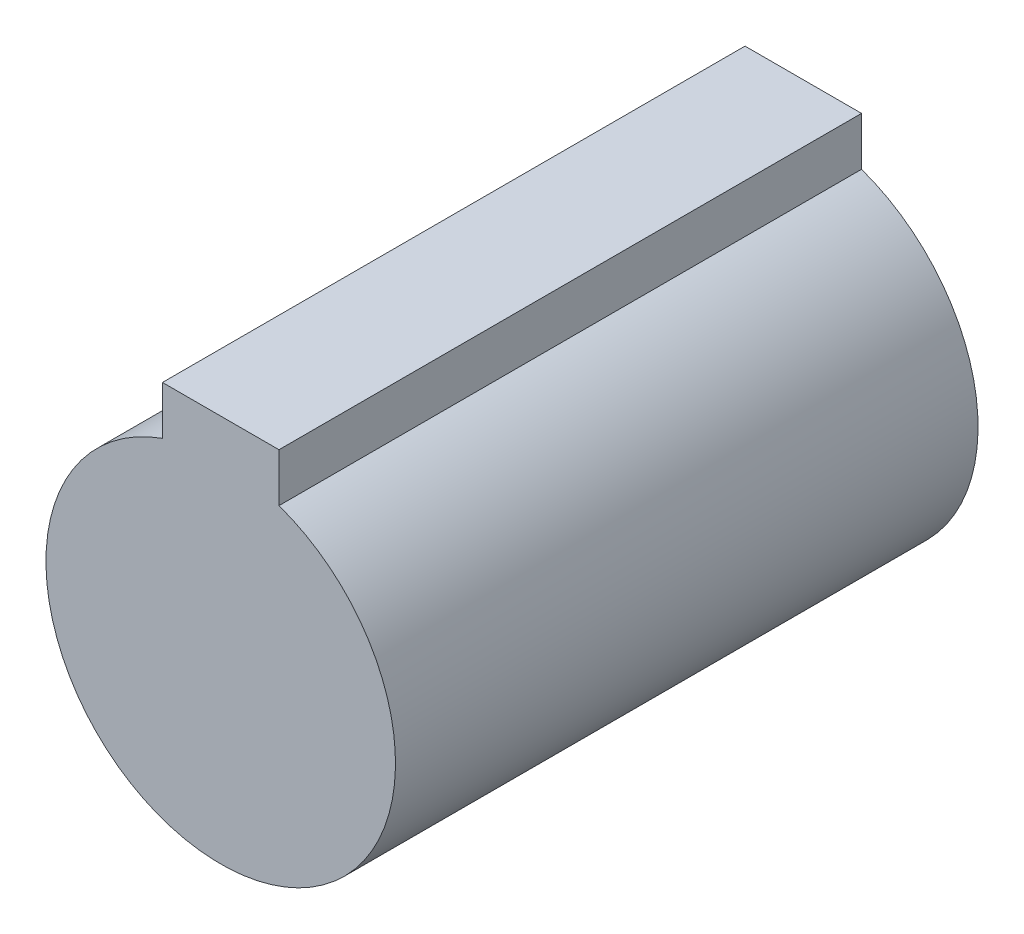
ISO-10303-21;
HEADER;
FILE_DESCRIPTION(('STEP AP214'),'2;1');
FILE_NAME('part.step','',(''),(''),'','','');
FILE_SCHEMA(('AUTOMOTIVE_DESIGN { 1 0 10303 214 1 1 1 1 }'));
ENDSEC;
DATA;
#1=APPLICATION_CONTEXT('core data for automotive mechanical design processes');
#2=APPLICATION_PROTOCOL_DEFINITION('international standard','automotive_design',2000,#1);
#3=PRODUCT_CONTEXT('',#1,'mechanical');
#4=PRODUCT('Part','Part','',(#3));
#5=PRODUCT_RELATED_PRODUCT_CATEGORY('part','',(#4));
#6=PRODUCT_DEFINITION_FORMATION('','',#4);
#7=PRODUCT_DEFINITION_CONTEXT('part definition',#1,'design');
#8=PRODUCT_DEFINITION('design','',#6,#7);
#9=PRODUCT_DEFINITION_SHAPE('','',#8);
#10=(LENGTH_UNIT() NAMED_UNIT(*) SI_UNIT(.MILLI.,.METRE.));
#11=(NAMED_UNIT(*) PLANE_ANGLE_UNIT() SI_UNIT($,.RADIAN.));
#12=(NAMED_UNIT(*) SI_UNIT($,.STERADIAN.) SOLID_ANGLE_UNIT());
#13=UNCERTAINTY_MEASURE_WITH_UNIT(LENGTH_MEASURE(1.E-05),#10,'distance_accuracy_value','');
#14=(GEOMETRIC_REPRESENTATION_CONTEXT(3) GLOBAL_UNCERTAINTY_ASSIGNED_CONTEXT((#13)) GLOBAL_UNIT_ASSIGNED_CONTEXT((#10,
#11,#12)) REPRESENTATION_CONTEXT('',''));
#15=CARTESIAN_POINT('',(0.,0.,0.));
#16=DIRECTION('',(0.,0.,1.));
#17=DIRECTION('',(1.,0.,0.));
#18=AXIS2_PLACEMENT_3D('',#15,#16,#17);
#19=CARTESIAN_POINT('',(0.,0.,50.));
#20=DIRECTION('',(0.,0.,-1.));
#21=DIRECTION('',(-1.,0.,0.));
#22=AXIS2_PLACEMENT_3D('',#19,#20,#21);
#23=CYLINDRICAL_SURFACE('',#22,15.);
#24=CARTESIAN_POINT('',(0.,0.,0.));
#25=DIRECTION('',(0.,0.,1.));
#26=DIRECTION('',(1.,0.,0.));
#27=AXIS2_PLACEMENT_3D('',#24,#25,#26);
#28=CIRCLE('',#27,15.);
#29=CARTESIAN_POINT('',(-5.,14.1421356237309,0.));
#30=VERTEX_POINT('',#29);
#31=CARTESIAN_POINT('',(5.,14.1421356237309,0.));
#32=VERTEX_POINT('',#31);
#33=EDGE_CURVE('E100',#30,#32,#28,.T.);
#34=ORIENTED_EDGE('',*,*,#33,.T.);
#35=DIRECTION('',(0.,0.,-1.));
#36=VECTOR('',#35,1.);
#37=CARTESIAN_POINT('',(5.,14.1421356237309,50.));
#38=LINE('',#37,#36);
#39=CARTESIAN_POINT('',(5.,14.1421356237309,50.));
#40=VERTEX_POINT('',#39);
#41=EDGE_CURVE('E11',#40,#32,#38,.T.);
#42=ORIENTED_EDGE('',*,*,#41,.F.);
#43=CARTESIAN_POINT('',(0.,0.,50.));
#44=DIRECTION('',(0.,0.,1.));
#45=DIRECTION('',(1.,0.,0.));
#46=AXIS2_PLACEMENT_3D('',#43,#44,#45);
#47=CIRCLE('',#46,15.);
#48=CARTESIAN_POINT('',(-5.,14.1421356237309,50.));
#49=VERTEX_POINT('',#48);
#50=EDGE_CURVE('E88',#49,#40,#47,.T.);
#51=ORIENTED_EDGE('',*,*,#50,.F.);
#52=DIRECTION('',(0.,0.,-1.));
#53=VECTOR('',#52,1.);
#54=CARTESIAN_POINT('',(-5.,14.1421356237309,50.));
#55=LINE('',#54,#53);
#56=EDGE_CURVE('E96',#49,#30,#55,.T.);
#57=ORIENTED_EDGE('',*,*,#56,.T.);
#58=EDGE_LOOP('',(#34,#42,#51,#57));
#59=FACE_BOUND('',#58,.T.);
#60=ADVANCED_FACE('F37',(#59),#23,.T.);
#61=CARTESIAN_POINT('',(5.,18.3,50.));
#62=DIRECTION('',(-1.,0.,0.));
#63=DIRECTION('',(0.,-1.,0.));
#64=AXIS2_PLACEMENT_3D('',#61,#62,#63);
#65=PLANE('',#64);
#66=DIRECTION('',(0.,1.,0.));
#67=VECTOR('',#66,1.);
#68=CARTESIAN_POINT('',(5.,18.3,0.));
#69=LINE('',#68,#67);
#70=CARTESIAN_POINT('',(5.,18.3,0.));
#71=VERTEX_POINT('',#70);
#72=EDGE_CURVE('E92',#32,#71,#69,.T.);
#73=ORIENTED_EDGE('',*,*,#72,.T.);
#74=DIRECTION('',(0.,0.,-1.));
#75=VECTOR('',#74,1.);
#76=CARTESIAN_POINT('',(5.,18.3,50.));
#77=LINE('',#76,#75);
#78=CARTESIAN_POINT('',(5.,18.3,50.));
#79=VERTEX_POINT('',#78);
#80=EDGE_CURVE('E45',#79,#71,#77,.T.);
#81=ORIENTED_EDGE('',*,*,#80,.F.);
#82=DIRECTION('',(0.,1.,0.));
#83=VECTOR('',#82,1.);
#84=CARTESIAN_POINT('',(5.,18.3,50.));
#85=LINE('',#84,#83);
#86=EDGE_CURVE('E83',#40,#79,#85,.T.);
#87=ORIENTED_EDGE('',*,*,#86,.F.);
#88=ORIENTED_EDGE('',*,*,#41,.T.);
#89=EDGE_LOOP('',(#73,#81,#87,#88));
#90=FACE_BOUND('',#89,.T.);
#91=ADVANCED_FACE('F91',(#90),#65,.F.);
#92=CARTESIAN_POINT('',(-5.,18.3,50.));
#93=DIRECTION('',(0.,-1.,0.));
#94=DIRECTION('',(0.,0.,-1.));
#95=AXIS2_PLACEMENT_3D('',#92,#93,#94);
#96=PLANE('',#95);
#97=DIRECTION('',(-1.,0.,0.));
#98=VECTOR('',#97,1.);
#99=CARTESIAN_POINT('',(-5.,18.3,0.));
#100=LINE('',#99,#98);
#101=CARTESIAN_POINT('',(-5.,18.3,0.));
#102=VERTEX_POINT('',#101);
#103=EDGE_CURVE('E70',#71,#102,#100,.T.);
#104=ORIENTED_EDGE('',*,*,#103,.T.);
#105=DIRECTION('',(0.,0.,-1.));
#106=VECTOR('',#105,1.);
#107=CARTESIAN_POINT('',(-5.,18.3,50.));
#108=LINE('',#107,#106);
#109=CARTESIAN_POINT('',(-5.,18.3,50.));
#110=VERTEX_POINT('',#109);
#111=EDGE_CURVE('E93',#110,#102,#108,.T.);
#112=ORIENTED_EDGE('',*,*,#111,.F.);
#113=DIRECTION('',(-1.,0.,0.));
#114=VECTOR('',#113,1.);
#115=CARTESIAN_POINT('',(-5.,18.3,50.));
#116=LINE('',#115,#114);
#117=EDGE_CURVE('E86',#79,#110,#116,.T.);
#118=ORIENTED_EDGE('',*,*,#117,.F.);
#119=ORIENTED_EDGE('',*,*,#80,.T.);
#120=EDGE_LOOP('',(#104,#112,#118,#119));
#121=FACE_BOUND('',#120,.T.);
#122=ADVANCED_FACE('F94',(#121),#96,.F.);
#123=CARTESIAN_POINT('',(-5.,14.1421356237309,50.));
#124=DIRECTION('',(1.,0.,0.));
#125=DIRECTION('',(0.,0.,-1.));
#126=AXIS2_PLACEMENT_3D('',#123,#124,#125);
#127=PLANE('',#126);
#128=DIRECTION('',(0.,-1.,0.));
#129=VECTOR('',#128,1.);
#130=CARTESIAN_POINT('',(-5.,14.1421356237309,0.));
#131=LINE('',#130,#129);
#132=EDGE_CURVE('E76',#102,#30,#131,.T.);
#133=ORIENTED_EDGE('',*,*,#132,.T.);
#134=ORIENTED_EDGE('',*,*,#56,.F.);
#135=DIRECTION('',(0.,-1.,0.));
#136=VECTOR('',#135,1.);
#137=CARTESIAN_POINT('',(-5.,14.1421356237309,50.));
#138=LINE('',#137,#136);
#139=EDGE_CURVE('E53',#110,#49,#138,.T.);
#140=ORIENTED_EDGE('',*,*,#139,.F.);
#141=ORIENTED_EDGE('',*,*,#111,.T.);
#142=EDGE_LOOP('',(#133,#134,#140,#141));
#143=FACE_BOUND('',#142,.T.);
#144=ADVANCED_FACE('F107',(#143),#127,.F.);
#145=CARTESIAN_POINT('',(0.,0.,50.));
#146=DIRECTION('',(0.,0.,1.));
#147=DIRECTION('',(1.,0.,0.));
#148=AXIS2_PLACEMENT_3D('',#145,#146,#147);
#149=PLANE('',#148);
#150=ORIENTED_EDGE('',*,*,#50,.T.);
#151=ORIENTED_EDGE('',*,*,#86,.T.);
#152=ORIENTED_EDGE('',*,*,#117,.T.);
#153=ORIENTED_EDGE('',*,*,#139,.T.);
#154=EDGE_LOOP('',(#150,#151,#152,#153));
#155=FACE_BOUND('',#154,.T.);
#156=ADVANCED_FACE('F84',(#155),#149,.T.);
#157=CARTESIAN_POINT('',(0.,0.,0.));
#158=DIRECTION('',(0.,0.,1.));
#159=DIRECTION('',(1.,0.,0.));
#160=AXIS2_PLACEMENT_3D('',#157,#158,#159);
#161=PLANE('',#160);
#162=ORIENTED_EDGE('',*,*,#33,.F.);
#163=ORIENTED_EDGE('',*,*,#132,.F.);
#164=ORIENTED_EDGE('',*,*,#103,.F.);
#165=ORIENTED_EDGE('',*,*,#72,.F.);
#166=EDGE_LOOP('',(#162,#163,#164,#165));
#167=FACE_BOUND('',#166,.T.);
#168=ADVANCED_FACE('F110',(#167),#161,.F.);
#169=CLOSED_SHELL('',(#60,#91,#122,#144,#156,#168));
#170=MANIFOLD_SOLID_BREP('B2',#169);
#171=ADVANCED_BREP_SHAPE_REPRESENTATION('',(#18,#170),#14);
#172=SHAPE_DEFINITION_REPRESENTATION(#9,#171);
ENDSEC;
END-ISO-10303-21;
